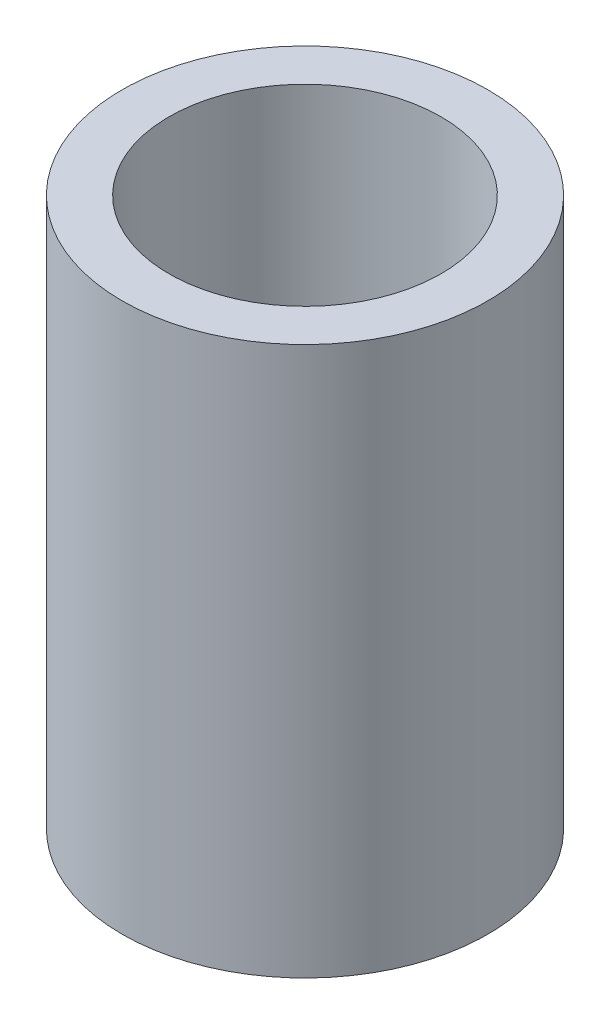
ISO-10303-21;
HEADER;
FILE_DESCRIPTION(('STEP AP214'),'2;1');
FILE_NAME('part.step','',(''),(''),'','','');
FILE_SCHEMA(('AUTOMOTIVE_DESIGN { 1 0 10303 214 1 1 1 1 }'));
ENDSEC;
DATA;
#1=APPLICATION_CONTEXT('core data for automotive mechanical design processes');
#2=APPLICATION_PROTOCOL_DEFINITION('international standard','automotive_design',2000,#1);
#3=PRODUCT_CONTEXT('',#1,'mechanical');
#4=PRODUCT('Part','Part','',(#3));
#5=PRODUCT_RELATED_PRODUCT_CATEGORY('part','',(#4));
#6=PRODUCT_DEFINITION_FORMATION('','',#4);
#7=PRODUCT_DEFINITION_CONTEXT('part definition',#1,'design');
#8=PRODUCT_DEFINITION('design','',#6,#7);
#9=PRODUCT_DEFINITION_SHAPE('','',#8);
#10=(LENGTH_UNIT() NAMED_UNIT(*) SI_UNIT(.MILLI.,.METRE.));
#11=(NAMED_UNIT(*) PLANE_ANGLE_UNIT() SI_UNIT($,.RADIAN.));
#12=(NAMED_UNIT(*) SI_UNIT($,.STERADIAN.) SOLID_ANGLE_UNIT());
#13=UNCERTAINTY_MEASURE_WITH_UNIT(LENGTH_MEASURE(1.E-05),#10,'distance_accuracy_value','');
#14=(GEOMETRIC_REPRESENTATION_CONTEXT(3) GLOBAL_UNCERTAINTY_ASSIGNED_CONTEXT((#13)) GLOBAL_UNIT_ASSIGNED_CONTEXT((#10,
#11,#12)) REPRESENTATION_CONTEXT('',''));
#15=CARTESIAN_POINT('',(0.,0.,0.));
#16=DIRECTION('',(0.,0.,1.));
#17=DIRECTION('',(1.,0.,0.));
#18=AXIS2_PLACEMENT_3D('',#15,#16,#17);
#19=CARTESIAN_POINT('',(0.,9.525,0.));
#20=DIRECTION('',(0.,1.,0.));
#21=DIRECTION('',(0.,0.,1.));
#22=AXIS2_PLACEMENT_3D('',#19,#20,#21);
#23=PLANE('',#22);
#24=CARTESIAN_POINT('',(0.,9.525,0.));
#25=DIRECTION('',(0.,1.,0.));
#26=DIRECTION('',(0.,0.,1.));
#27=AXIS2_PLACEMENT_3D('',#24,#25,#26);
#28=CIRCLE('',#27,3.175);
#29=CARTESIAN_POINT('',(0.,9.525,-3.175));
#30=VERTEX_POINT('',#29);
#31=EDGE_CURVE('E10',#30,#30,#28,.T.);
#32=ORIENTED_EDGE('',*,*,#31,.T.);
#33=EDGE_LOOP('',(#32));
#34=FACE_BOUND('',#33,.T.);
#35=CARTESIAN_POINT('',(0.,9.525,0.));
#36=DIRECTION('',(0.,1.,0.));
#37=DIRECTION('',(0.,0.,1.));
#38=AXIS2_PLACEMENT_3D('',#35,#36,#37);
#39=CIRCLE('',#38,2.3622);
#40=CARTESIAN_POINT('',(0.,9.525,-2.3622));
#41=VERTEX_POINT('',#40);
#42=EDGE_CURVE('E42',#41,#41,#39,.T.);
#43=ORIENTED_EDGE('',*,*,#42,.F.);
#44=EDGE_LOOP('',(#43));
#45=FACE_BOUND('',#44,.T.);
#46=ADVANCED_FACE('F31',(#34,#45),#23,.T.);
#47=CARTESIAN_POINT('',(0.,0.,0.));
#48=DIRECTION('',(0.,1.,0.));
#49=DIRECTION('',(0.,0.,1.));
#50=AXIS2_PLACEMENT_3D('',#47,#48,#49);
#51=PLANE('',#50);
#52=CARTESIAN_POINT('',(0.,0.,0.));
#53=DIRECTION('',(0.,1.,0.));
#54=DIRECTION('',(0.,0.,1.));
#55=AXIS2_PLACEMENT_3D('',#52,#53,#54);
#56=CIRCLE('',#55,3.175);
#57=CARTESIAN_POINT('',(0.,0.,-3.175));
#58=VERTEX_POINT('',#57);
#59=EDGE_CURVE('E35',#58,#58,#56,.T.);
#60=ORIENTED_EDGE('',*,*,#59,.F.);
#61=EDGE_LOOP('',(#60));
#62=FACE_BOUND('',#61,.T.);
#63=CARTESIAN_POINT('',(0.,0.,0.));
#64=DIRECTION('',(0.,1.,0.));
#65=DIRECTION('',(0.,0.,1.));
#66=AXIS2_PLACEMENT_3D('',#63,#64,#65);
#67=CIRCLE('',#66,2.3622);
#68=CARTESIAN_POINT('',(0.,0.,-2.3622));
#69=VERTEX_POINT('',#68);
#70=EDGE_CURVE('E44',#69,#69,#67,.T.);
#71=ORIENTED_EDGE('',*,*,#70,.T.);
#72=EDGE_LOOP('',(#71));
#73=FACE_BOUND('',#72,.T.);
#74=ADVANCED_FACE('F54',(#62,#73),#51,.F.);
#75=CARTESIAN_POINT('',(0.,9.525,0.));
#76=DIRECTION('',(0.,-1.,0.));
#77=DIRECTION('',(0.,0.,-1.));
#78=AXIS2_PLACEMENT_3D('',#75,#76,#77);
#79=CYLINDRICAL_SURFACE('',#78,3.175);
#80=CARTESIAN_POINT('',(0.,9.525,-3.175));
#81=CARTESIAN_POINT('',(0.,9.42578125,-3.175));
#82=CARTESIAN_POINT('',(0.,9.3265625,-3.175));
#83=CARTESIAN_POINT('',(0.,9.128125,-3.175));
#84=CARTESIAN_POINT('',(0.,9.02890625,-3.175));
#85=CARTESIAN_POINT('',(0.,8.83046875,-3.175));
#86=CARTESIAN_POINT('',(0.,8.73125,-3.175));
#87=CARTESIAN_POINT('',(0.,8.5328125,-3.175));
#88=CARTESIAN_POINT('',(0.,8.43359375,-3.175));
#89=CARTESIAN_POINT('',(0.,8.23515625,-3.175));
#90=CARTESIAN_POINT('',(0.,8.1359375,-3.175));
#91=CARTESIAN_POINT('',(0.,7.9375,-3.175));
#92=CARTESIAN_POINT('',(0.,7.83828125,-3.175));
#93=CARTESIAN_POINT('',(0.,7.63984375,-3.175));
#94=CARTESIAN_POINT('',(0.,7.540625,-3.175));
#95=CARTESIAN_POINT('',(0.,7.3421875,-3.175));
#96=CARTESIAN_POINT('',(0.,7.24296875,-3.175));
#97=CARTESIAN_POINT('',(0.,7.04453125,-3.175));
#98=CARTESIAN_POINT('',(0.,6.9453125,-3.175));
#99=CARTESIAN_POINT('',(0.,6.746875,-3.175));
#100=CARTESIAN_POINT('',(0.,6.64765625,-3.175));
#101=CARTESIAN_POINT('',(0.,6.44921875,-3.175));
#102=CARTESIAN_POINT('',(0.,6.35,-3.175));
#103=CARTESIAN_POINT('',(0.,6.1515625,-3.175));
#104=CARTESIAN_POINT('',(0.,6.05234375,-3.175));
#105=CARTESIAN_POINT('',(0.,5.85390625,-3.175));
#106=CARTESIAN_POINT('',(0.,5.7546875,-3.175));
#107=CARTESIAN_POINT('',(0.,5.55625,-3.175));
#108=CARTESIAN_POINT('',(0.,5.45703125,-3.175));
#109=CARTESIAN_POINT('',(0.,5.25859375,-3.175));
#110=CARTESIAN_POINT('',(0.,5.159375,-3.175));
#111=CARTESIAN_POINT('',(0.,4.9609375,-3.175));
#112=CARTESIAN_POINT('',(0.,4.86171875,-3.175));
#113=CARTESIAN_POINT('',(0.,4.66328125,-3.175));
#114=CARTESIAN_POINT('',(0.,4.5640625,-3.175));
#115=CARTESIAN_POINT('',(0.,4.365625,-3.175));
#116=CARTESIAN_POINT('',(0.,4.26640625,-3.175));
#117=CARTESIAN_POINT('',(0.,4.06796875,-3.175));
#118=CARTESIAN_POINT('',(0.,3.96875,-3.175));
#119=CARTESIAN_POINT('',(0.,3.7703125,-3.175));
#120=CARTESIAN_POINT('',(0.,3.67109375,-3.175));
#121=CARTESIAN_POINT('',(0.,3.47265625,-3.175));
#122=CARTESIAN_POINT('',(0.,3.3734375,-3.175));
#123=CARTESIAN_POINT('',(0.,3.175,-3.175));
#124=CARTESIAN_POINT('',(0.,3.07578125,-3.175));
#125=CARTESIAN_POINT('',(0.,2.87734375,-3.175));
#126=CARTESIAN_POINT('',(0.,2.778125,-3.175));
#127=CARTESIAN_POINT('',(0.,2.5796875,-3.175));
#128=CARTESIAN_POINT('',(0.,2.48046875,-3.175));
#129=CARTESIAN_POINT('',(0.,2.28203125,-3.175));
#130=CARTESIAN_POINT('',(0.,2.1828125,-3.175));
#131=CARTESIAN_POINT('',(0.,1.984375,-3.175));
#132=CARTESIAN_POINT('',(0.,1.88515625,-3.175));
#133=CARTESIAN_POINT('',(0.,1.68671875,-3.175));
#134=CARTESIAN_POINT('',(0.,1.5875,-3.175));
#135=CARTESIAN_POINT('',(0.,1.3890625,-3.175));
#136=CARTESIAN_POINT('',(0.,1.28984375,-3.175));
#137=CARTESIAN_POINT('',(0.,1.09140625,-3.175));
#138=CARTESIAN_POINT('',(0.,0.992187500000001,-3.175));
#139=CARTESIAN_POINT('',(0.,0.793750000000001,-3.175));
#140=CARTESIAN_POINT('',(0.,0.69453125,-3.175));
#141=CARTESIAN_POINT('',(0.,0.49609375,-3.175));
#142=CARTESIAN_POINT('',(0.,0.396875,-3.175));
#143=CARTESIAN_POINT('',(0.,0.1984375,-3.175));
#144=CARTESIAN_POINT('',(0.,0.0992187500000001,-3.175));
#145=CARTESIAN_POINT('',(0.,0.,-3.175));
#146=B_SPLINE_CURVE_WITH_KNOTS('',3,(#80,#81,#82,#83,#84,#85,#86,#87,#88,#89,#90,#91,#92,#93,
#94,#95,#96,#97,#98,#99,#100,#101,#102,#103,#104,#105,#106,#107,#108,#109,#110,#111,#112,#113,
#114,#115,#116,#117,#118,#119,#120,#121,#122,#123,#124,#125,#126,#127,#128,#129,#130,#131,#132,
#133,#134,#135,#136,#137,#138,#139,#140,#141,#142,#143,#144,#145),.UNSPECIFIED.,.F.,.F.,(4,2,2,
2,2,2,2,2,2,2,2,2,2,2,2,2,2,2,2,2,2,2,2,2,2,2,2,2,2,2,2,2,4),(0.,0.29765625,0.5953125,
0.892968750000001,1.190625,1.48828125,1.7859375,2.08359375,2.38125,2.67890625,2.9765625,
3.27421875,3.571875,3.86953125,4.1671875,4.46484375,4.7625,5.06015625,5.3578125,5.65546875,
5.953125,6.25078125,6.5484375,6.84609375,7.14375,7.44140625,7.7390625,8.03671875,8.334375,
8.63203125,8.9296875,9.22734375,9.525),.UNSPECIFIED.);
#147=EDGE_CURVE('BSEAM33',#30,#58,#146,.T.);
#148=ORIENTED_EDGE('',*,*,#31,.F.);
#149=ORIENTED_EDGE('',*,*,#59,.T.);
#150=ORIENTED_EDGE('',*,*,#147,.T.);
#151=ORIENTED_EDGE('',*,*,#147,.F.);
#152=EDGE_LOOP('',(#148,#150,#149,#151));
#153=FACE_BOUND('',#152,.T.);
#154=ADVANCED_FACE('F33',(#153),#79,.T.);
#155=CARTESIAN_POINT('',(0.,9.525,0.));
#156=DIRECTION('',(0.,-1.,0.));
#157=DIRECTION('',(0.,0.,-1.));
#158=AXIS2_PLACEMENT_3D('',#155,#156,#157);
#159=CYLINDRICAL_SURFACE('',#158,2.3622);
#160=CARTESIAN_POINT('',(0.,9.525,-2.3622));
#161=CARTESIAN_POINT('',(0.,9.42578125,-2.3622));
#162=CARTESIAN_POINT('',(0.,9.3265625,-2.3622));
#163=CARTESIAN_POINT('',(0.,9.128125,-2.3622));
#164=CARTESIAN_POINT('',(0.,9.02890625,-2.3622));
#165=CARTESIAN_POINT('',(0.,8.83046875,-2.3622));
#166=CARTESIAN_POINT('',(0.,8.73125,-2.3622));
#167=CARTESIAN_POINT('',(0.,8.5328125,-2.3622));
#168=CARTESIAN_POINT('',(0.,8.43359375,-2.3622));
#169=CARTESIAN_POINT('',(0.,8.23515625,-2.3622));
#170=CARTESIAN_POINT('',(0.,8.1359375,-2.3622));
#171=CARTESIAN_POINT('',(0.,7.9375,-2.3622));
#172=CARTESIAN_POINT('',(0.,7.83828125,-2.3622));
#173=CARTESIAN_POINT('',(0.,7.63984375,-2.3622));
#174=CARTESIAN_POINT('',(0.,7.540625,-2.3622));
#175=CARTESIAN_POINT('',(0.,7.3421875,-2.3622));
#176=CARTESIAN_POINT('',(0.,7.24296875,-2.3622));
#177=CARTESIAN_POINT('',(0.,7.04453125,-2.3622));
#178=CARTESIAN_POINT('',(0.,6.9453125,-2.3622));
#179=CARTESIAN_POINT('',(0.,6.746875,-2.3622));
#180=CARTESIAN_POINT('',(0.,6.64765625,-2.3622));
#181=CARTESIAN_POINT('',(0.,6.44921875,-2.3622));
#182=CARTESIAN_POINT('',(0.,6.35,-2.3622));
#183=CARTESIAN_POINT('',(0.,6.1515625,-2.3622));
#184=CARTESIAN_POINT('',(0.,6.05234375,-2.3622));
#185=CARTESIAN_POINT('',(0.,5.85390625,-2.3622));
#186=CARTESIAN_POINT('',(0.,5.7546875,-2.3622));
#187=CARTESIAN_POINT('',(0.,5.55625,-2.3622));
#188=CARTESIAN_POINT('',(0.,5.45703125,-2.3622));
#189=CARTESIAN_POINT('',(0.,5.25859375,-2.3622));
#190=CARTESIAN_POINT('',(0.,5.159375,-2.3622));
#191=CARTESIAN_POINT('',(0.,4.9609375,-2.3622));
#192=CARTESIAN_POINT('',(0.,4.86171875,-2.3622));
#193=CARTESIAN_POINT('',(0.,4.66328125,-2.3622));
#194=CARTESIAN_POINT('',(0.,4.5640625,-2.3622));
#195=CARTESIAN_POINT('',(0.,4.365625,-2.3622));
#196=CARTESIAN_POINT('',(0.,4.26640625,-2.3622));
#197=CARTESIAN_POINT('',(0.,4.06796875,-2.3622));
#198=CARTESIAN_POINT('',(0.,3.96875,-2.3622));
#199=CARTESIAN_POINT('',(0.,3.7703125,-2.3622));
#200=CARTESIAN_POINT('',(0.,3.67109375,-2.3622));
#201=CARTESIAN_POINT('',(0.,3.47265625,-2.3622));
#202=CARTESIAN_POINT('',(0.,3.3734375,-2.3622));
#203=CARTESIAN_POINT('',(0.,3.175,-2.3622));
#204=CARTESIAN_POINT('',(0.,3.07578125,-2.3622));
#205=CARTESIAN_POINT('',(0.,2.87734375,-2.3622));
#206=CARTESIAN_POINT('',(0.,2.778125,-2.3622));
#207=CARTESIAN_POINT('',(0.,2.5796875,-2.3622));
#208=CARTESIAN_POINT('',(0.,2.48046875,-2.3622));
#209=CARTESIAN_POINT('',(0.,2.28203125,-2.3622));
#210=CARTESIAN_POINT('',(0.,2.1828125,-2.3622));
#211=CARTESIAN_POINT('',(0.,1.984375,-2.3622));
#212=CARTESIAN_POINT('',(0.,1.88515625,-2.3622));
#213=CARTESIAN_POINT('',(0.,1.68671875,-2.3622));
#214=CARTESIAN_POINT('',(0.,1.5875,-2.3622));
#215=CARTESIAN_POINT('',(0.,1.3890625,-2.3622));
#216=CARTESIAN_POINT('',(0.,1.28984375,-2.3622));
#217=CARTESIAN_POINT('',(0.,1.09140625,-2.3622));
#218=CARTESIAN_POINT('',(0.,0.992187500000001,-2.3622));
#219=CARTESIAN_POINT('',(0.,0.793750000000001,-2.3622));
#220=CARTESIAN_POINT('',(0.,0.69453125,-2.3622));
#221=CARTESIAN_POINT('',(0.,0.49609375,-2.3622));
#222=CARTESIAN_POINT('',(0.,0.396875,-2.3622));
#223=CARTESIAN_POINT('',(0.,0.1984375,-2.3622));
#224=CARTESIAN_POINT('',(0.,0.0992187500000001,-2.3622));
#225=CARTESIAN_POINT('',(0.,0.,-2.3622));
#226=B_SPLINE_CURVE_WITH_KNOTS('',3,(#160,#161,#162,#163,#164,#165,#166,#167,#168,#169,#170,
#171,#172,#173,#174,#175,#176,#177,#178,#179,#180,#181,#182,#183,#184,#185,#186,#187,#188,#189,
#190,#191,#192,#193,#194,#195,#196,#197,#198,#199,#200,#201,#202,#203,#204,#205,#206,#207,#208,
#209,#210,#211,#212,#213,#214,#215,#216,#217,#218,#219,#220,#221,#222,#223,#224,#225),
.UNSPECIFIED.,.F.,.F.,(4,2,2,2,2,2,2,2,2,2,2,2,2,2,2,2,2,2,2,2,2,2,2,2,2,2,2,2,2,2,2,2,4),(0.,
0.29765625,0.5953125,0.892968750000001,1.190625,1.48828125,1.7859375,2.08359375,2.38125,
2.67890625,2.9765625,3.27421875,3.571875,3.86953125,4.1671875,4.46484375,4.7625,5.06015625,
5.3578125,5.65546875,5.953125,6.25078125,6.5484375,6.84609375,7.14375,7.44140625,7.7390625,
8.03671875,8.334375,8.63203125,8.9296875,9.22734375,9.525),.UNSPECIFIED.);
#227=EDGE_CURVE('BSEAM50',#41,#69,#226,.T.);
#228=ORIENTED_EDGE('',*,*,#42,.T.);
#229=ORIENTED_EDGE('',*,*,#70,.F.);
#230=ORIENTED_EDGE('',*,*,#227,.T.);
#231=ORIENTED_EDGE('',*,*,#227,.F.);
#232=EDGE_LOOP('',(#228,#230,#229,#231));
#233=FACE_BOUND('',#232,.T.);
#234=ADVANCED_FACE('F50',(#233),#159,.F.);
#235=CLOSED_SHELL('',(#46,#74,#154,#234));
#236=MANIFOLD_SOLID_BREP('B2',#235);
#237=ADVANCED_BREP_SHAPE_REPRESENTATION('',(#18,#236),#14);
#238=SHAPE_DEFINITION_REPRESENTATION(#9,#237);
ENDSEC;
END-ISO-10303-21;
